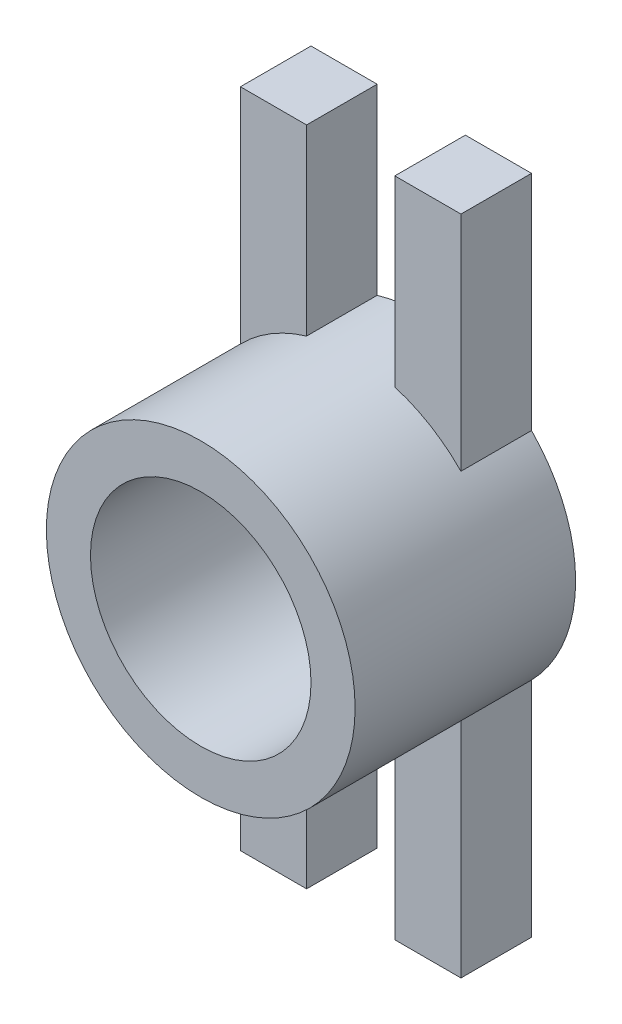
ISO-10303-21;
HEADER;
FILE_DESCRIPTION(('STEP AP214'),'2;1');
FILE_NAME('part.step','',(''),(''),'','','');
FILE_SCHEMA(('AUTOMOTIVE_DESIGN { 1 0 10303 214 1 1 1 1 }'));
ENDSEC;
DATA;
#1=APPLICATION_CONTEXT('core data for automotive mechanical design processes');
#2=APPLICATION_PROTOCOL_DEFINITION('international standard','automotive_design',2000,#1);
#3=PRODUCT_CONTEXT('',#1,'mechanical');
#4=PRODUCT('Part','Part','',(#3));
#5=PRODUCT_RELATED_PRODUCT_CATEGORY('part','',(#4));
#6=PRODUCT_DEFINITION_FORMATION('','',#4);
#7=PRODUCT_DEFINITION_CONTEXT('part definition',#1,'design');
#8=PRODUCT_DEFINITION('design','',#6,#7);
#9=PRODUCT_DEFINITION_SHAPE('','',#8);
#10=(LENGTH_UNIT() NAMED_UNIT(*) SI_UNIT(.MILLI.,.METRE.));
#11=(NAMED_UNIT(*) PLANE_ANGLE_UNIT() SI_UNIT($,.RADIAN.));
#12=(NAMED_UNIT(*) SI_UNIT($,.STERADIAN.) SOLID_ANGLE_UNIT());
#13=UNCERTAINTY_MEASURE_WITH_UNIT(LENGTH_MEASURE(1.E-05),#10,'distance_accuracy_value','');
#14=(GEOMETRIC_REPRESENTATION_CONTEXT(3) GLOBAL_UNCERTAINTY_ASSIGNED_CONTEXT((#13)) GLOBAL_UNIT_ASSIGNED_CONTEXT((#10,
#11,#12)) REPRESENTATION_CONTEXT('',''));
#15=CARTESIAN_POINT('',(0.,0.,0.));
#16=DIRECTION('',(0.,0.,1.));
#17=DIRECTION('',(1.,0.,0.));
#18=AXIS2_PLACEMENT_3D('',#15,#16,#17);
#19=CARTESIAN_POINT('',(0.,0.,50.));
#20=DIRECTION('',(0.,0.,-1.));
#21=DIRECTION('',(-1.,0.,0.));
#22=AXIS2_PLACEMENT_3D('',#19,#20,#21);
#23=CYLINDRICAL_SURFACE('',#22,35.);
#24=CARTESIAN_POINT('',(0.,0.,50.));
#25=DIRECTION('',(0.,0.,1.));
#26=DIRECTION('',(1.,0.,0.));
#27=AXIS2_PLACEMENT_3D('',#24,#25,#26);
#28=CIRCLE('',#27,35.);
#29=CARTESIAN_POINT('',(35.,0.,50.));
#30=VERTEX_POINT('',#29);
#31=EDGE_CURVE('E11',#30,#30,#28,.T.);
#32=ORIENTED_EDGE('',*,*,#31,.F.);
#33=EDGE_LOOP('',(#32));
#34=FACE_BOUND('',#33,.T.);
#35=CARTESIAN_POINT('',(0.,0.,0.));
#36=DIRECTION('',(0.,0.,1.));
#37=DIRECTION('',(1.,0.,0.));
#38=AXIS2_PLACEMENT_3D('',#35,#36,#37);
#39=CIRCLE('',#38,35.);
#40=CARTESIAN_POINT('',(-25.,24.4948974278318,0.));
#41=VERTEX_POINT('',#40);
#42=CARTESIAN_POINT('',(-25.,-24.4948974278318,0.));
#43=VERTEX_POINT('',#42);
#44=EDGE_CURVE('E284',#41,#43,#39,.T.);
#45=ORIENTED_EDGE('',*,*,#44,.T.);
#46=DIRECTION('',(0.,0.,-1.));
#47=VECTOR('',#46,1.);
#48=CARTESIAN_POINT('',(-25.,-24.4948974278318,16.));
#49=LINE('',#48,#47);
#50=CARTESIAN_POINT('',(-25.,-24.4948974278318,16.));
#51=VERTEX_POINT('',#50);
#52=EDGE_CURVE('E63',#51,#43,#49,.T.);
#53=ORIENTED_EDGE('',*,*,#52,.F.);
#54=CARTESIAN_POINT('',(0.,0.,16.));
#55=DIRECTION('',(0.,0.,1.));
#56=DIRECTION('',(1.,0.,0.));
#57=AXIS2_PLACEMENT_3D('',#54,#55,#56);
#58=CIRCLE('',#57,35.);
#59=CARTESIAN_POINT('',(-10.,-33.5410196624969,16.));
#60=VERTEX_POINT('',#59);
#61=EDGE_CURVE('E58',#51,#60,#58,.T.);
#62=ORIENTED_EDGE('',*,*,#61,.T.);
#63=DIRECTION('',(0.,0.,-1.));
#64=VECTOR('',#63,1.);
#65=CARTESIAN_POINT('',(-10.,-33.5410196624969,16.));
#66=LINE('',#65,#64);
#67=CARTESIAN_POINT('',(-10.,-33.5410196624969,0.));
#68=VERTEX_POINT('',#67);
#69=EDGE_CURVE('E234',#60,#68,#66,.T.);
#70=ORIENTED_EDGE('',*,*,#69,.T.);
#71=CARTESIAN_POINT('',(10.,-33.5410196624969,0.));
#72=VERTEX_POINT('',#71);
#73=EDGE_CURVE('E283',#68,#72,#39,.T.);
#74=ORIENTED_EDGE('',*,*,#73,.T.);
#75=DIRECTION('',(0.,0.,-1.));
#76=VECTOR('',#75,1.);
#77=CARTESIAN_POINT('',(10.,-33.5410196624969,16.));
#78=LINE('',#77,#76);
#79=CARTESIAN_POINT('',(10.,-33.5410196624969,16.));
#80=VERTEX_POINT('',#79);
#81=EDGE_CURVE('E187',#80,#72,#78,.T.);
#82=ORIENTED_EDGE('',*,*,#81,.F.);
#83=CARTESIAN_POINT('',(0.,0.,16.));
#84=DIRECTION('',(0.,0.,1.));
#85=DIRECTION('',(1.,0.,0.));
#86=AXIS2_PLACEMENT_3D('',#83,#84,#85);
#87=CIRCLE('',#86,35.);
#88=CARTESIAN_POINT('',(25.,-24.4948974278318,16.));
#89=VERTEX_POINT('',#88);
#90=EDGE_CURVE('E197',#80,#89,#87,.T.);
#91=ORIENTED_EDGE('',*,*,#90,.T.);
#92=DIRECTION('',(0.,0.,-1.));
#93=VECTOR('',#92,1.);
#94=CARTESIAN_POINT('',(25.,-24.4948974278318,16.));
#95=LINE('',#94,#93);
#96=CARTESIAN_POINT('',(25.,-24.4948974278318,0.));
#97=VERTEX_POINT('',#96);
#98=EDGE_CURVE('E208',#89,#97,#95,.T.);
#99=ORIENTED_EDGE('',*,*,#98,.T.);
#100=CARTESIAN_POINT('',(25.,24.4948974278318,0.));
#101=VERTEX_POINT('',#100);
#102=EDGE_CURVE('E45',#97,#101,#39,.T.);
#103=ORIENTED_EDGE('',*,*,#102,.T.);
#104=DIRECTION('',(0.,0.,-1.));
#105=VECTOR('',#104,1.);
#106=CARTESIAN_POINT('',(25.,24.4948974278318,16.));
#107=LINE('',#106,#105);
#108=CARTESIAN_POINT('',(25.,24.4948974278318,16.));
#109=VERTEX_POINT('',#108);
#110=EDGE_CURVE('E175',#109,#101,#107,.T.);
#111=ORIENTED_EDGE('',*,*,#110,.F.);
#112=CARTESIAN_POINT('',(0.,0.,16.));
#113=DIRECTION('',(0.,0.,1.));
#114=DIRECTION('',(1.,0.,0.));
#115=AXIS2_PLACEMENT_3D('',#112,#113,#114);
#116=CIRCLE('',#115,35.);
#117=CARTESIAN_POINT('',(10.,33.5410196624969,16.));
#118=VERTEX_POINT('',#117);
#119=EDGE_CURVE('E163',#109,#118,#116,.T.);
#120=ORIENTED_EDGE('',*,*,#119,.T.);
#121=DIRECTION('',(0.,0.,-1.));
#122=VECTOR('',#121,1.);
#123=CARTESIAN_POINT('',(10.,33.5410196624969,16.));
#124=LINE('',#123,#122);
#125=CARTESIAN_POINT('',(10.,33.5410196624969,0.));
#126=VERTEX_POINT('',#125);
#127=EDGE_CURVE('E181',#118,#126,#124,.T.);
#128=ORIENTED_EDGE('',*,*,#127,.T.);
#129=CARTESIAN_POINT('',(-10.,33.5410196624969,0.));
#130=VERTEX_POINT('',#129);
#131=EDGE_CURVE('E279',#126,#130,#39,.T.);
#132=ORIENTED_EDGE('',*,*,#131,.T.);
#133=DIRECTION('',(0.,0.,-1.));
#134=VECTOR('',#133,1.);
#135=CARTESIAN_POINT('',(-10.,33.5410196624969,16.));
#136=LINE('',#135,#134);
#137=CARTESIAN_POINT('',(-10.,33.5410196624969,16.));
#138=VERTEX_POINT('',#137);
#139=EDGE_CURVE('E274',#138,#130,#136,.T.);
#140=ORIENTED_EDGE('',*,*,#139,.F.);
#141=CARTESIAN_POINT('',(0.,0.,16.));
#142=DIRECTION('',(0.,0.,1.));
#143=DIRECTION('',(1.,0.,0.));
#144=AXIS2_PLACEMENT_3D('',#141,#142,#143);
#145=CIRCLE('',#144,35.);
#146=CARTESIAN_POINT('',(-25.,24.4948974278318,16.));
#147=VERTEX_POINT('',#146);
#148=EDGE_CURVE('E249',#138,#147,#145,.T.);
#149=ORIENTED_EDGE('',*,*,#148,.T.);
#150=DIRECTION('',(0.,0.,-1.));
#151=VECTOR('',#150,1.);
#152=CARTESIAN_POINT('',(-25.,24.4948974278318,16.));
#153=LINE('',#152,#151);
#154=EDGE_CURVE('E260',#147,#41,#153,.T.);
#155=ORIENTED_EDGE('',*,*,#154,.T.);
#156=EDGE_LOOP('',(#45,#53,#62,#70,#74,#82,#91,#99,#103,#111,#120,#128,#132,#140,#149,#155));
#157=FACE_BOUND('',#156,.T.);
#158=ADVANCED_FACE('F41',(#34,#157),#23,.T.);
#159=CARTESIAN_POINT('',(0.,0.,50.));
#160=DIRECTION('',(0.,0.,-1.));
#161=DIRECTION('',(-1.,0.,0.));
#162=AXIS2_PLACEMENT_3D('',#159,#160,#161);
#163=CYLINDRICAL_SURFACE('',#162,25.);
#164=CARTESIAN_POINT('',(0.,0.,50.));
#165=DIRECTION('',(0.,0.,1.));
#166=DIRECTION('',(1.,0.,0.));
#167=AXIS2_PLACEMENT_3D('',#164,#165,#166);
#168=CIRCLE('',#167,25.);
#169=CARTESIAN_POINT('',(25.,0.,50.));
#170=VERTEX_POINT('',#169);
#171=EDGE_CURVE('E50',#170,#170,#168,.T.);
#172=ORIENTED_EDGE('',*,*,#171,.T.);
#173=EDGE_LOOP('',(#172));
#174=FACE_BOUND('',#173,.T.);
#175=CARTESIAN_POINT('',(0.,0.,0.));
#176=DIRECTION('',(0.,0.,1.));
#177=DIRECTION('',(1.,0.,0.));
#178=AXIS2_PLACEMENT_3D('',#175,#176,#177);
#179=CIRCLE('',#178,25.);
#180=CARTESIAN_POINT('',(25.,0.,0.));
#181=VERTEX_POINT('',#180);
#182=EDGE_CURVE('E277',#181,#181,#179,.T.);
#183=ORIENTED_EDGE('',*,*,#182,.F.);
#184=EDGE_LOOP('',(#183));
#185=FACE_BOUND('',#184,.T.);
#186=ADVANCED_FACE('F43',(#174,#185),#163,.F.);
#187=CARTESIAN_POINT('',(0.,0.,50.));
#188=DIRECTION('',(0.,0.,1.));
#189=DIRECTION('',(1.,0.,0.));
#190=AXIS2_PLACEMENT_3D('',#187,#188,#189);
#191=PLANE('',#190);
#192=ORIENTED_EDGE('',*,*,#171,.F.);
#193=EDGE_LOOP('',(#192));
#194=FACE_BOUND('',#193,.T.);
#195=ORIENTED_EDGE('',*,*,#31,.T.);
#196=EDGE_LOOP('',(#195));
#197=FACE_BOUND('',#196,.T.);
#198=ADVANCED_FACE('F319',(#194,#197),#191,.T.);
#199=CARTESIAN_POINT('',(0.,0.,0.));
#200=DIRECTION('',(0.,0.,1.));
#201=DIRECTION('',(1.,0.,0.));
#202=AXIS2_PLACEMENT_3D('',#199,#200,#201);
#203=PLANE('',#202);
#204=ORIENTED_EDGE('',*,*,#182,.T.);
#205=EDGE_LOOP('',(#204));
#206=FACE_BOUND('',#205,.T.);
#207=ORIENTED_EDGE('',*,*,#131,.F.);
#208=DIRECTION('',(0.,1.,0.));
#209=VECTOR('',#208,1.);
#210=CARTESIAN_POINT('',(10.,0.,0.));
#211=LINE('',#210,#209);
#212=CARTESIAN_POINT('',(10.,75.,0.));
#213=VERTEX_POINT('',#212);
#214=EDGE_CURVE('E189',#126,#213,#211,.T.);
#215=ORIENTED_EDGE('',*,*,#214,.T.);
#216=DIRECTION('',(1.,0.,0.));
#217=VECTOR('',#216,1.);
#218=CARTESIAN_POINT('',(0.,75.,0.));
#219=LINE('',#218,#217);
#220=CARTESIAN_POINT('',(25.,75.,0.));
#221=VERTEX_POINT('',#220);
#222=EDGE_CURVE('E186',#213,#221,#219,.T.);
#223=ORIENTED_EDGE('',*,*,#222,.T.);
#224=DIRECTION('',(0.,1.,0.));
#225=VECTOR('',#224,1.);
#226=CARTESIAN_POINT('',(25.,0.,0.));
#227=LINE('',#226,#225);
#228=EDGE_CURVE('E171',#101,#221,#227,.T.);
#229=ORIENTED_EDGE('',*,*,#228,.F.);
#230=ORIENTED_EDGE('',*,*,#102,.F.);
#231=DIRECTION('',(0.,1.,0.));
#232=VECTOR('',#231,1.);
#233=CARTESIAN_POINT('',(25.,0.,0.));
#234=LINE('',#233,#232);
#235=CARTESIAN_POINT('',(25.,-75.,0.));
#236=VERTEX_POINT('',#235);
#237=EDGE_CURVE('E200',#236,#97,#234,.T.);
#238=ORIENTED_EDGE('',*,*,#237,.F.);
#239=DIRECTION('',(1.,0.,0.));
#240=VECTOR('',#239,1.);
#241=CARTESIAN_POINT('',(0.,-75.,0.));
#242=LINE('',#241,#240);
#243=CARTESIAN_POINT('',(10.,-75.,0.));
#244=VERTEX_POINT('',#243);
#245=EDGE_CURVE('E212',#244,#236,#242,.T.);
#246=ORIENTED_EDGE('',*,*,#245,.F.);
#247=DIRECTION('',(0.,1.,0.));
#248=VECTOR('',#247,1.);
#249=CARTESIAN_POINT('',(10.,0.,0.));
#250=LINE('',#249,#248);
#251=EDGE_CURVE('E209',#244,#72,#250,.T.);
#252=ORIENTED_EDGE('',*,*,#251,.T.);
#253=ORIENTED_EDGE('',*,*,#73,.F.);
#254=DIRECTION('',(0.,1.,0.));
#255=VECTOR('',#254,1.);
#256=CARTESIAN_POINT('',(-10.,0.,0.));
#257=LINE('',#256,#255);
#258=CARTESIAN_POINT('',(-10.,-75.,0.));
#259=VERTEX_POINT('',#258);
#260=EDGE_CURVE('E227',#259,#68,#257,.T.);
#261=ORIENTED_EDGE('',*,*,#260,.F.);
#262=DIRECTION('',(1.,0.,0.));
#263=VECTOR('',#262,1.);
#264=CARTESIAN_POINT('',(0.,-75.,0.));
#265=LINE('',#264,#263);
#266=CARTESIAN_POINT('',(-25.,-75.,0.));
#267=VERTEX_POINT('',#266);
#268=EDGE_CURVE('E238',#267,#259,#265,.T.);
#269=ORIENTED_EDGE('',*,*,#268,.F.);
#270=DIRECTION('',(0.,1.,0.));
#271=VECTOR('',#270,1.);
#272=CARTESIAN_POINT('',(-25.,0.,0.));
#273=LINE('',#272,#271);
#274=EDGE_CURVE('E235',#267,#43,#273,.T.);
#275=ORIENTED_EDGE('',*,*,#274,.T.);
#276=ORIENTED_EDGE('',*,*,#44,.F.);
#277=DIRECTION('',(0.,1.,0.));
#278=VECTOR('',#277,1.);
#279=CARTESIAN_POINT('',(-25.,0.,0.));
#280=LINE('',#279,#278);
#281=CARTESIAN_POINT('',(-25.,75.,0.));
#282=VERTEX_POINT('',#281);
#283=EDGE_CURVE('E252',#41,#282,#280,.T.);
#284=ORIENTED_EDGE('',*,*,#283,.T.);
#285=DIRECTION('',(1.,0.,0.));
#286=VECTOR('',#285,1.);
#287=CARTESIAN_POINT('',(0.,75.,0.));
#288=LINE('',#287,#286);
#289=CARTESIAN_POINT('',(-10.,75.,0.));
#290=VERTEX_POINT('',#289);
#291=EDGE_CURVE('E263',#282,#290,#288,.T.);
#292=ORIENTED_EDGE('',*,*,#291,.T.);
#293=DIRECTION('',(0.,1.,0.));
#294=VECTOR('',#293,1.);
#295=CARTESIAN_POINT('',(-10.,0.,0.));
#296=LINE('',#295,#294);
#297=EDGE_CURVE('E196',#130,#290,#296,.T.);
#298=ORIENTED_EDGE('',*,*,#297,.F.);
#299=EDGE_LOOP('',(#207,#215,#223,#229,#230,#238,#246,#252,#253,#261,#269,#275,#276,#284,#292,#298));
#300=FACE_BOUND('',#299,.T.);
#301=ADVANCED_FACE('F293',(#206,#300),#203,.F.);
#302=CARTESIAN_POINT('',(-10.,0.,16.));
#303=DIRECTION('',(-1.,0.,0.));
#304=DIRECTION('',(0.,0.,1.));
#305=AXIS2_PLACEMENT_3D('',#302,#303,#304);
#306=PLANE('',#305);
#307=ORIENTED_EDGE('',*,*,#297,.T.);
#308=DIRECTION('',(0.,0.,-1.));
#309=VECTOR('',#308,1.);
#310=CARTESIAN_POINT('',(-10.,75.,16.));
#311=LINE('',#310,#309);
#312=CARTESIAN_POINT('',(-10.,75.,16.));
#313=VERTEX_POINT('',#312);
#314=EDGE_CURVE('E272',#313,#290,#311,.T.);
#315=ORIENTED_EDGE('',*,*,#314,.F.);
#316=DIRECTION('',(0.,1.,0.));
#317=VECTOR('',#316,1.);
#318=CARTESIAN_POINT('',(-10.,0.,16.));
#319=LINE('',#318,#317);
#320=EDGE_CURVE('E251',#138,#313,#319,.T.);
#321=ORIENTED_EDGE('',*,*,#320,.F.);
#322=ORIENTED_EDGE('',*,*,#139,.T.);
#323=EDGE_LOOP('',(#307,#315,#321,#322));
#324=FACE_BOUND('',#323,.T.);
#325=ADVANCED_FACE('F324',(#324),#306,.F.);
#326=CARTESIAN_POINT('',(0.,75.,16.));
#327=DIRECTION('',(0.,1.,0.));
#328=DIRECTION('',(-1.,0.,0.));
#329=AXIS2_PLACEMENT_3D('',#326,#327,#328);
#330=PLANE('',#329);
#331=ORIENTED_EDGE('',*,*,#291,.F.);
#332=DIRECTION('',(0.,0.,-1.));
#333=VECTOR('',#332,1.);
#334=CARTESIAN_POINT('',(-25.,75.,16.));
#335=LINE('',#334,#333);
#336=CARTESIAN_POINT('',(-25.,75.,16.));
#337=VERTEX_POINT('',#336);
#338=EDGE_CURVE('E270',#337,#282,#335,.T.);
#339=ORIENTED_EDGE('',*,*,#338,.F.);
#340=DIRECTION('',(1.,0.,0.));
#341=VECTOR('',#340,1.);
#342=CARTESIAN_POINT('',(0.,75.,16.));
#343=LINE('',#342,#341);
#344=EDGE_CURVE('E254',#337,#313,#343,.T.);
#345=ORIENTED_EDGE('',*,*,#344,.T.);
#346=ORIENTED_EDGE('',*,*,#314,.T.);
#347=EDGE_LOOP('',(#331,#339,#345,#346));
#348=FACE_BOUND('',#347,.T.);
#349=ADVANCED_FACE('F329',(#348),#330,.T.);
#350=CARTESIAN_POINT('',(-25.,0.,16.));
#351=DIRECTION('',(-1.,0.,0.));
#352=DIRECTION('',(0.,-1.,0.));
#353=AXIS2_PLACEMENT_3D('',#350,#351,#352);
#354=PLANE('',#353);
#355=ORIENTED_EDGE('',*,*,#283,.F.);
#356=ORIENTED_EDGE('',*,*,#154,.F.);
#357=DIRECTION('',(0.,1.,0.));
#358=VECTOR('',#357,1.);
#359=CARTESIAN_POINT('',(-25.,0.,16.));
#360=LINE('',#359,#358);
#361=EDGE_CURVE('E257',#147,#337,#360,.T.);
#362=ORIENTED_EDGE('',*,*,#361,.T.);
#363=ORIENTED_EDGE('',*,*,#338,.T.);
#364=EDGE_LOOP('',(#355,#356,#362,#363));
#365=FACE_BOUND('',#364,.T.);
#366=ADVANCED_FACE('F333',(#365),#354,.T.);
#367=CARTESIAN_POINT('',(0.,0.,16.));
#368=DIRECTION('',(0.,0.,1.));
#369=DIRECTION('',(1.,0.,0.));
#370=AXIS2_PLACEMENT_3D('',#367,#368,#369);
#371=PLANE('',#370);
#372=ORIENTED_EDGE('',*,*,#148,.F.);
#373=ORIENTED_EDGE('',*,*,#320,.T.);
#374=ORIENTED_EDGE('',*,*,#344,.F.);
#375=ORIENTED_EDGE('',*,*,#361,.F.);
#376=EDGE_LOOP('',(#372,#373,#374,#375));
#377=FACE_BOUND('',#376,.T.);
#378=ADVANCED_FACE('F337',(#377),#371,.T.);
#379=CARTESIAN_POINT('',(25.,0.,16.));
#380=DIRECTION('',(-1.,0.,0.));
#381=DIRECTION('',(0.,-1.,0.));
#382=AXIS2_PLACEMENT_3D('',#379,#380,#381);
#383=PLANE('',#382);
#384=ORIENTED_EDGE('',*,*,#228,.T.);
#385=DIRECTION('',(0.,0.,-1.));
#386=VECTOR('',#385,1.);
#387=CARTESIAN_POINT('',(25.,75.,16.));
#388=LINE('',#387,#386);
#389=CARTESIAN_POINT('',(25.,75.,16.));
#390=VERTEX_POINT('',#389);
#391=EDGE_CURVE('E168',#390,#221,#388,.T.);
#392=ORIENTED_EDGE('',*,*,#391,.F.);
#393=DIRECTION('',(0.,1.,0.));
#394=VECTOR('',#393,1.);
#395=CARTESIAN_POINT('',(25.,0.,16.));
#396=LINE('',#395,#394);
#397=EDGE_CURVE('E156',#109,#390,#396,.T.);
#398=ORIENTED_EDGE('',*,*,#397,.F.);
#399=ORIENTED_EDGE('',*,*,#110,.T.);
#400=EDGE_LOOP('',(#384,#392,#398,#399));
#401=FACE_BOUND('',#400,.T.);
#402=ADVANCED_FACE('F169',(#401),#383,.F.);
#403=CARTESIAN_POINT('',(0.,75.,16.));
#404=DIRECTION('',(0.,1.,0.));
#405=DIRECTION('',(-1.,0.,0.));
#406=AXIS2_PLACEMENT_3D('',#403,#404,#405);
#407=PLANE('',#406);
#408=ORIENTED_EDGE('',*,*,#222,.F.);
#409=DIRECTION('',(0.,0.,-1.));
#410=VECTOR('',#409,1.);
#411=CARTESIAN_POINT('',(10.,75.,16.));
#412=LINE('',#411,#410);
#413=CARTESIAN_POINT('',(10.,75.,16.));
#414=VERTEX_POINT('',#413);
#415=EDGE_CURVE('E176',#414,#213,#412,.T.);
#416=ORIENTED_EDGE('',*,*,#415,.F.);
#417=DIRECTION('',(1.,0.,0.));
#418=VECTOR('',#417,1.);
#419=CARTESIAN_POINT('',(0.,75.,16.));
#420=LINE('',#419,#418);
#421=EDGE_CURVE('E161',#414,#390,#420,.T.);
#422=ORIENTED_EDGE('',*,*,#421,.T.);
#423=ORIENTED_EDGE('',*,*,#391,.T.);
#424=EDGE_LOOP('',(#408,#416,#422,#423));
#425=FACE_BOUND('',#424,.T.);
#426=ADVANCED_FACE('F178',(#425),#407,.T.);
#427=CARTESIAN_POINT('',(10.,0.,16.));
#428=DIRECTION('',(-1.,0.,0.));
#429=DIRECTION('',(0.,0.,1.));
#430=AXIS2_PLACEMENT_3D('',#427,#428,#429);
#431=PLANE('',#430);
#432=ORIENTED_EDGE('',*,*,#214,.F.);
#433=ORIENTED_EDGE('',*,*,#127,.F.);
#434=DIRECTION('',(0.,1.,0.));
#435=VECTOR('',#434,1.);
#436=CARTESIAN_POINT('',(10.,0.,16.));
#437=LINE('',#436,#435);
#438=EDGE_CURVE('E179',#118,#414,#437,.T.);
#439=ORIENTED_EDGE('',*,*,#438,.T.);
#440=ORIENTED_EDGE('',*,*,#415,.T.);
#441=EDGE_LOOP('',(#432,#433,#439,#440));
#442=FACE_BOUND('',#441,.T.);
#443=ADVANCED_FACE('F407',(#442),#431,.T.);
#444=CARTESIAN_POINT('',(0.,0.,16.));
#445=DIRECTION('',(0.,0.,1.));
#446=DIRECTION('',(1.,0.,0.));
#447=AXIS2_PLACEMENT_3D('',#444,#445,#446);
#448=PLANE('',#447);
#449=ORIENTED_EDGE('',*,*,#119,.F.);
#450=ORIENTED_EDGE('',*,*,#397,.T.);
#451=ORIENTED_EDGE('',*,*,#421,.F.);
#452=ORIENTED_EDGE('',*,*,#438,.F.);
#453=EDGE_LOOP('',(#449,#450,#451,#452));
#454=FACE_BOUND('',#453,.T.);
#455=ADVANCED_FACE('F158',(#454),#448,.T.);
#456=CARTESIAN_POINT('',(10.,0.,16.));
#457=DIRECTION('',(-1.,0.,0.));
#458=DIRECTION('',(0.,-1.,0.));
#459=AXIS2_PLACEMENT_3D('',#456,#457,#458);
#460=PLANE('',#459);
#461=ORIENTED_EDGE('',*,*,#251,.F.);
#462=DIRECTION('',(0.,0.,-1.));
#463=VECTOR('',#462,1.);
#464=CARTESIAN_POINT('',(10.,-75.,16.));
#465=LINE('',#464,#463);
#466=CARTESIAN_POINT('',(10.,-75.,16.));
#467=VERTEX_POINT('',#466);
#468=EDGE_CURVE('E221',#467,#244,#465,.T.);
#469=ORIENTED_EDGE('',*,*,#468,.F.);
#470=DIRECTION('',(0.,1.,0.));
#471=VECTOR('',#470,1.);
#472=CARTESIAN_POINT('',(10.,0.,16.));
#473=LINE('',#472,#471);
#474=EDGE_CURVE('E199',#467,#80,#473,.T.);
#475=ORIENTED_EDGE('',*,*,#474,.T.);
#476=ORIENTED_EDGE('',*,*,#81,.T.);
#477=EDGE_LOOP('',(#461,#469,#475,#476));
#478=FACE_BOUND('',#477,.T.);
#479=ADVANCED_FACE('F391',(#478),#460,.T.);
#480=CARTESIAN_POINT('',(0.,-75.,16.));
#481=DIRECTION('',(0.,1.,0.));
#482=DIRECTION('',(-1.,0.,0.));
#483=AXIS2_PLACEMENT_3D('',#480,#481,#482);
#484=PLANE('',#483);
#485=ORIENTED_EDGE('',*,*,#245,.T.);
#486=DIRECTION('',(0.,0.,-1.));
#487=VECTOR('',#486,1.);
#488=CARTESIAN_POINT('',(25.,-75.,16.));
#489=LINE('',#488,#487);
#490=CARTESIAN_POINT('',(25.,-75.,16.));
#491=VERTEX_POINT('',#490);
#492=EDGE_CURVE('E218',#491,#236,#489,.T.);
#493=ORIENTED_EDGE('',*,*,#492,.F.);
#494=DIRECTION('',(1.,0.,0.));
#495=VECTOR('',#494,1.);
#496=CARTESIAN_POINT('',(0.,-75.,16.));
#497=LINE('',#496,#495);
#498=EDGE_CURVE('E203',#467,#491,#497,.T.);
#499=ORIENTED_EDGE('',*,*,#498,.F.);
#500=ORIENTED_EDGE('',*,*,#468,.T.);
#501=EDGE_LOOP('',(#485,#493,#499,#500));
#502=FACE_BOUND('',#501,.T.);
#503=ADVANCED_FACE('F382',(#502),#484,.F.);
#504=CARTESIAN_POINT('',(25.,0.,16.));
#505=DIRECTION('',(-1.,0.,0.));
#506=DIRECTION('',(0.,-1.,0.));
#507=AXIS2_PLACEMENT_3D('',#504,#505,#506);
#508=PLANE('',#507);
#509=ORIENTED_EDGE('',*,*,#237,.T.);
#510=ORIENTED_EDGE('',*,*,#98,.F.);
#511=DIRECTION('',(0.,1.,0.));
#512=VECTOR('',#511,1.);
#513=CARTESIAN_POINT('',(25.,0.,16.));
#514=LINE('',#513,#512);
#515=EDGE_CURVE('E205',#491,#89,#514,.T.);
#516=ORIENTED_EDGE('',*,*,#515,.F.);
#517=ORIENTED_EDGE('',*,*,#492,.T.);
#518=EDGE_LOOP('',(#509,#510,#516,#517));
#519=FACE_BOUND('',#518,.T.);
#520=ADVANCED_FACE('F373',(#519),#508,.F.);
#521=CARTESIAN_POINT('',(0.,0.,16.));
#522=DIRECTION('',(0.,0.,1.));
#523=DIRECTION('',(1.,0.,0.));
#524=AXIS2_PLACEMENT_3D('',#521,#522,#523);
#525=PLANE('',#524);
#526=ORIENTED_EDGE('',*,*,#90,.F.);
#527=ORIENTED_EDGE('',*,*,#474,.F.);
#528=ORIENTED_EDGE('',*,*,#498,.T.);
#529=ORIENTED_EDGE('',*,*,#515,.T.);
#530=EDGE_LOOP('',(#526,#527,#528,#529));
#531=FACE_BOUND('',#530,.T.);
#532=ADVANCED_FACE('F344',(#531),#525,.T.);
#533=CARTESIAN_POINT('',(-25.,0.,16.));
#534=DIRECTION('',(-1.,0.,0.));
#535=DIRECTION('',(0.,-1.,0.));
#536=AXIS2_PLACEMENT_3D('',#533,#534,#535);
#537=PLANE('',#536);
#538=ORIENTED_EDGE('',*,*,#274,.F.);
#539=DIRECTION('',(0.,0.,-1.));
#540=VECTOR('',#539,1.);
#541=CARTESIAN_POINT('',(-25.,-75.,16.));
#542=LINE('',#541,#540);
#543=CARTESIAN_POINT('',(-25.,-75.,16.));
#544=VERTEX_POINT('',#543);
#545=EDGE_CURVE('E246',#544,#267,#542,.T.);
#546=ORIENTED_EDGE('',*,*,#545,.F.);
#547=DIRECTION('',(0.,1.,0.));
#548=VECTOR('',#547,1.);
#549=CARTESIAN_POINT('',(-25.,0.,16.));
#550=LINE('',#549,#548);
#551=EDGE_CURVE('E226',#544,#51,#550,.T.);
#552=ORIENTED_EDGE('',*,*,#551,.T.);
#553=ORIENTED_EDGE('',*,*,#52,.T.);
#554=EDGE_LOOP('',(#538,#546,#552,#553));
#555=FACE_BOUND('',#554,.T.);
#556=ADVANCED_FACE('F290',(#555),#537,.T.);
#557=CARTESIAN_POINT('',(0.,-75.,16.));
#558=DIRECTION('',(0.,1.,0.));
#559=DIRECTION('',(-1.,0.,0.));
#560=AXIS2_PLACEMENT_3D('',#557,#558,#559);
#561=PLANE('',#560);
#562=ORIENTED_EDGE('',*,*,#268,.T.);
#563=DIRECTION('',(0.,0.,-1.));
#564=VECTOR('',#563,1.);
#565=CARTESIAN_POINT('',(-10.,-75.,16.));
#566=LINE('',#565,#564);
#567=CARTESIAN_POINT('',(-10.,-75.,16.));
#568=VERTEX_POINT('',#567);
#569=EDGE_CURVE('E243',#568,#259,#566,.T.);
#570=ORIENTED_EDGE('',*,*,#569,.F.);
#571=DIRECTION('',(1.,0.,0.));
#572=VECTOR('',#571,1.);
#573=CARTESIAN_POINT('',(0.,-75.,16.));
#574=LINE('',#573,#572);
#575=EDGE_CURVE('E230',#544,#568,#574,.T.);
#576=ORIENTED_EDGE('',*,*,#575,.F.);
#577=ORIENTED_EDGE('',*,*,#545,.T.);
#578=EDGE_LOOP('',(#562,#570,#576,#577));
#579=FACE_BOUND('',#578,.T.);
#580=ADVANCED_FACE('F297',(#579),#561,.F.);
#581=CARTESIAN_POINT('',(-10.,0.,16.));
#582=DIRECTION('',(-1.,0.,0.));
#583=DIRECTION('',(0.,0.,1.));
#584=AXIS2_PLACEMENT_3D('',#581,#582,#583);
#585=PLANE('',#584);
#586=ORIENTED_EDGE('',*,*,#260,.T.);
#587=ORIENTED_EDGE('',*,*,#69,.F.);
#588=DIRECTION('',(0.,1.,0.));
#589=VECTOR('',#588,1.);
#590=CARTESIAN_POINT('',(-10.,0.,16.));
#591=LINE('',#590,#589);
#592=EDGE_CURVE('E232',#568,#60,#591,.T.);
#593=ORIENTED_EDGE('',*,*,#592,.F.);
#594=ORIENTED_EDGE('',*,*,#569,.T.);
#595=EDGE_LOOP('',(#586,#587,#593,#594));
#596=FACE_BOUND('',#595,.T.);
#597=ADVANCED_FACE('F301',(#596),#585,.F.);
#598=CARTESIAN_POINT('',(0.,0.,16.));
#599=DIRECTION('',(0.,0.,1.));
#600=DIRECTION('',(1.,0.,0.));
#601=AXIS2_PLACEMENT_3D('',#598,#599,#600);
#602=PLANE('',#601);
#603=ORIENTED_EDGE('',*,*,#61,.F.);
#604=ORIENTED_EDGE('',*,*,#551,.F.);
#605=ORIENTED_EDGE('',*,*,#575,.T.);
#606=ORIENTED_EDGE('',*,*,#592,.T.);
#607=EDGE_LOOP('',(#603,#604,#605,#606));
#608=FACE_BOUND('',#607,.T.);
#609=ADVANCED_FACE('F304',(#608),#602,.T.);
#610=CLOSED_SHELL('',(#158,#186,#198,#301,#325,#349,#366,#378,#402,#426,#443,#455,#479,#503,
#520,#532,#556,#580,#597,#609));
#611=MANIFOLD_SOLID_BREP('B2',#610);
#612=ADVANCED_BREP_SHAPE_REPRESENTATION('',(#18,#611),#14);
#613=SHAPE_DEFINITION_REPRESENTATION(#9,#612);
ENDSEC;
END-ISO-10303-21;
